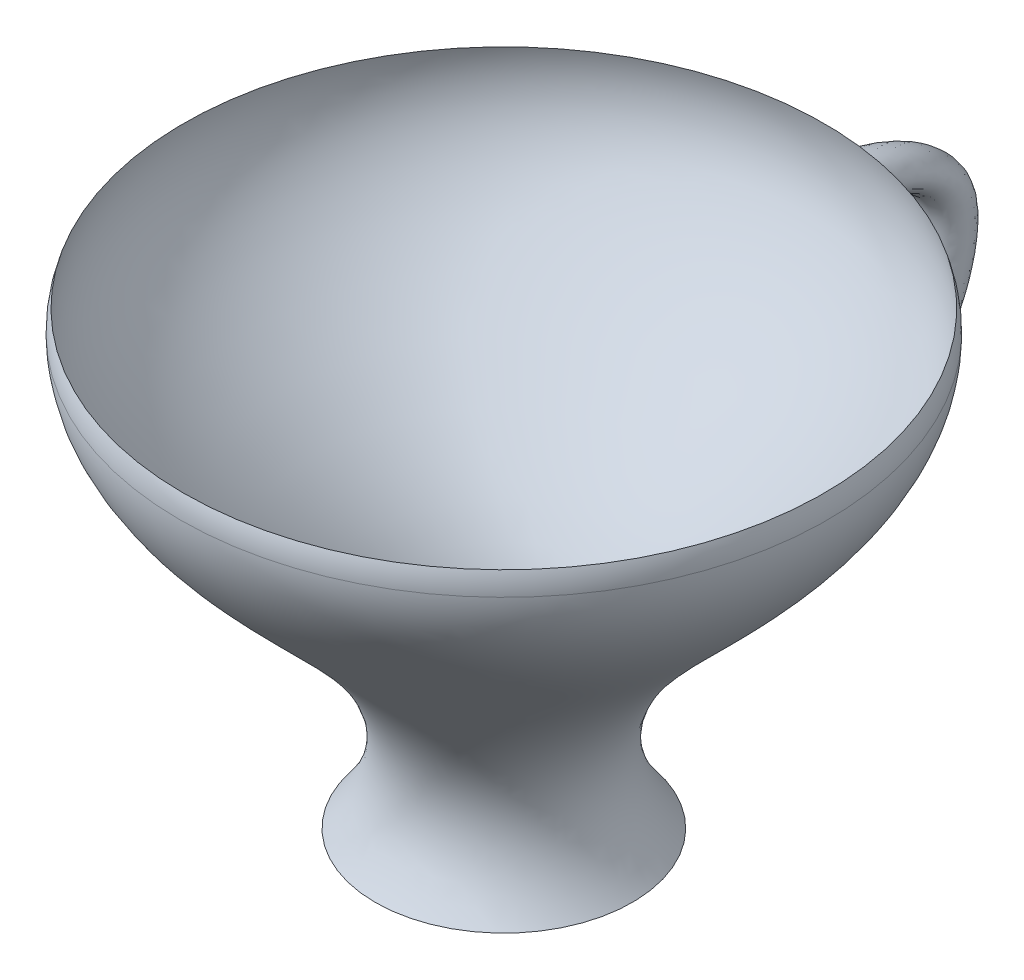
ISO-10303-21;
HEADER;
FILE_DESCRIPTION(('STEP AP214'),'2;1');
FILE_NAME('part.step','',(''),(''),'','','');
FILE_SCHEMA(('AUTOMOTIVE_DESIGN { 1 0 10303 214 1 1 1 1 }'));
ENDSEC;
DATA;
#1=APPLICATION_CONTEXT('core data for automotive mechanical design processes');
#2=APPLICATION_PROTOCOL_DEFINITION('international standard','automotive_design',2000,#1);
#3=PRODUCT_CONTEXT('',#1,'mechanical');
#4=PRODUCT('Part','Part','',(#3));
#5=PRODUCT_RELATED_PRODUCT_CATEGORY('part','',(#4));
#6=PRODUCT_DEFINITION_FORMATION('','',#4);
#7=PRODUCT_DEFINITION_CONTEXT('part definition',#1,'design');
#8=PRODUCT_DEFINITION('design','',#6,#7);
#9=PRODUCT_DEFINITION_SHAPE('','',#8);
#10=(LENGTH_UNIT() NAMED_UNIT(*) SI_UNIT(.MILLI.,.METRE.));
#11=(NAMED_UNIT(*) PLANE_ANGLE_UNIT() SI_UNIT($,.RADIAN.));
#12=(NAMED_UNIT(*) SI_UNIT($,.STERADIAN.) SOLID_ANGLE_UNIT());
#13=UNCERTAINTY_MEASURE_WITH_UNIT(LENGTH_MEASURE(1.E-05),#10,'distance_accuracy_value','');
#14=(GEOMETRIC_REPRESENTATION_CONTEXT(3) GLOBAL_UNCERTAINTY_ASSIGNED_CONTEXT((#13)) GLOBAL_UNIT_ASSIGNED_CONTEXT((#10,
#11,#12)) REPRESENTATION_CONTEXT('',''));
#15=CARTESIAN_POINT('',(0.,0.,0.));
#16=DIRECTION('',(0.,0.,1.));
#17=DIRECTION('',(1.,0.,0.));
#18=AXIS2_PLACEMENT_3D('',#15,#16,#17);
#19=CARTESIAN_POINT('',(0.,-27.2609819121447,40.077519379845));
#20=CARTESIAN_POINT('',(0.,-0.636487852068056,61.8374160642681));
#21=CARTESIAN_POINT('',(0.,18.2422413254179,4.86321013680653));
#22=CARTESIAN_POINT('',(0.,42.7390180878553,10.077519379845));
#23=CARTESIAN_POINT('',(0.,42.9839858554797,10.1296624722754));
#24=CARTESIAN_POINT('',(0.,43.228953623104,10.1818055647057));
#25=CARTESIAN_POINT('',(0.,43.4739213907284,10.2339486571361));
#26=B_SPLINE_CURVE_WITH_KNOTS('',3,(#19,#20,#21,#22,#23,#24,#25),.UNSPECIFIED.,.F.,.F.,(4,3,4),
(0.,1.,1.01),.UNSPECIFIED.);
#27=CARTESIAN_POINT('',(0.,42.7390180878553,60.077519379845));
#28=DIRECTION('',(0.,1.,0.));
#29=AXIS1_PLACEMENT('',#27,#28);
#30=SURFACE_OF_REVOLUTION('',#26,#29);
#31=CARTESIAN_POINT('',(0.,39.4140175954645,60.077519379845));
#32=DIRECTION('',(0.,1.,0.));
#33=DIRECTION('',(0.,0.,1.));
#34=AXIS2_PLACEMENT_3D('',#31,#32,#33);
#35=CIRCLE('',#34,50.338688689412);
#36=CARTESIAN_POINT('',(0.,39.4140175954645,110.416208069257));
#37=VERTEX_POINT('',#36);
#38=EDGE_CURVE('E42',#37,#37,#35,.F.);
#39=ORIENTED_EDGE('',*,*,#38,.T.);
#40=EDGE_LOOP('',(#39));
#41=FACE_BOUND('',#40,.T.);
#42=CARTESIAN_POINT('',(0.,-27.2609819121447,60.077519379845));
#43=DIRECTION('',(0.,1.,0.));
#44=DIRECTION('',(0.,0.,1.));
#45=AXIS2_PLACEMENT_3D('',#42,#43,#44);
#46=CIRCLE('',#45,20.);
#47=CARTESIAN_POINT('',(0.,-27.2609819121447,80.077519379845));
#48=VERTEX_POINT('',#47);
#49=EDGE_CURVE('E115',#48,#48,#46,.T.);
#50=ORIENTED_EDGE('',*,*,#49,.T.);
#51=EDGE_LOOP('',(#50));
#52=FACE_BOUND('',#51,.T.);
#53=CARTESIAN_POINT('',(2.03310562178877,32.2211152809582,11.4202010557278));
#54=CARTESIAN_POINT('',(2.03310130916848,32.0296062160161,11.5036331859808));
#55=CARTESIAN_POINT('',(2.01481290067568,31.8387709728222,11.5889735575393));
#56=CARTESIAN_POINT('',(1.94450578012794,31.4636517072631,11.7608411356719));
#57=CARTESIAN_POINT('',(1.89240209060572,31.2793854266813,11.8473707932215));
#58=CARTESIAN_POINT('',(1.75673686226993,30.9223077625742,12.0187760023312));
#59=CARTESIAN_POINT('',(1.67323327168575,30.7494759635576,12.1036542998223));
#60=CARTESIAN_POINT('',(1.52574466648536,30.5021788697816,12.227538076965));
#61=CARTESIAN_POINT('',(1.47289217861581,30.4217568015136,12.2682506859543));
#62=CARTESIAN_POINT('',(1.35988963247383,30.2653871388714,12.3481818672822));
#63=CARTESIAN_POINT('',(1.29973985114031,30.1894393748559,12.3874004962444));
#64=CARTESIAN_POINT('',(1.17013119349722,30.0401497408136,12.4652245470993));
#65=CARTESIAN_POINT('',(1.10042224296239,29.9669889387048,12.5037618085188));
#66=CARTESIAN_POINT('',(0.953644083949221,29.8269855833213,12.5782246441283));
#67=CARTESIAN_POINT('',(0.876574782873737,29.7601431095558,12.6141501854515));
#68=CARTESIAN_POINT('',(0.715747800401596,29.6332263643045,12.6830578406114));
#69=CARTESIAN_POINT('',(0.631986319273574,29.5731559852641,12.7160382594179));
#70=CARTESIAN_POINT('',(0.45861048633851,29.4602408255244,12.7787235851329));
#71=CARTESIAN_POINT('',(0.368996033877511,29.4073961691348,12.8084284356875));
#72=CARTESIAN_POINT('',(0.106944977514676,29.2679766320153,12.8878122879623));
#73=CARTESIAN_POINT('',(-0.0717344866228856,29.1904333669264,12.9332675244541));
#74=CARTESIAN_POINT('',(-0.441447279495883,29.0635388442283,13.0103215774558));
#75=CARTESIAN_POINT('',(-0.632474046038192,29.0141727463006,13.0419276859669));
#76=CARTESIAN_POINT('',(-1.02111028313078,28.9460789091262,13.0895123101621));
#77=CARTESIAN_POINT('',(-1.21868402099678,28.9272061956053,13.1055646262144));
#78=CARTESIAN_POINT('',(-1.51560883733806,28.9233430092687,13.1168431002445));
#79=CARTESIAN_POINT('',(-1.61470329182548,28.9261334472142,13.1184680322069));
#80=CARTESIAN_POINT('',(-1.812325305882,28.9397029567685,13.1175255732963));
#81=CARTESIAN_POINT('',(-1.91085282935899,28.9504825314353,13.1149579184133));
#82=CARTESIAN_POINT('',(-2.19077833409239,28.9924065680259,13.1017963161765));
#83=CARTESIAN_POINT('',(-2.37061586111997,29.0330913738215,13.0862005434331));
#84=CARTESIAN_POINT('',(-2.72098736141228,29.1395573145947,13.0419156236996));
#85=CARTESIAN_POINT('',(-2.89151468773003,29.2053561184845,13.0132172556045));
#86=CARTESIAN_POINT('',(-3.22568231254885,29.3635062475597,12.9423457397537));
#87=CARTESIAN_POINT('',(-3.38876905713786,29.456819802343,12.8996766786292));
#88=CARTESIAN_POINT('',(-3.61857063975539,29.6139399661438,12.8269989217293));
#89=CARTESIAN_POINT('',(-3.69269746236321,29.669169476369,12.8013283352296));
#90=CARTESIAN_POINT('',(-3.83550847671874,29.7850679707341,12.7472752449443));
#91=CARTESIAN_POINT('',(-3.90419317530627,29.8457364472038,12.7188929942477));
#92=CARTESIAN_POINT('',(-4.10098006884646,30.0350576188791,12.6301668951605));
#93=CARTESIAN_POINT('',(-4.22024617025701,30.1713206988212,12.5661067303183));
#94=CARTESIAN_POINT('',(-4.43361333658643,30.4593098394754,12.4311535434832));
#95=CARTESIAN_POINT('',(-4.52767891953543,30.6110572914327,12.3602510765715));
#96=CARTESIAN_POINT('',(-4.69411550991868,30.9348332129381,12.2100879456882));
#97=CARTESIAN_POINT('',(-4.7650012987494,31.1075189301131,12.1305819344976));
#98=CARTESIAN_POINT('',(-4.84834480119735,31.3727494241605,12.0097701713009));
#99=CARTESIAN_POINT('',(-4.87229600904299,31.4621999580435,11.9692377948748));
#100=CARTESIAN_POINT('',(-4.9123477229145,31.6427487350274,11.8878960367614));
#101=CARTESIAN_POINT('',(-4.92844814278487,31.7338469961993,11.847086652039));
#102=CARTESIAN_POINT('',(-4.95333777388172,31.923134173048,11.7628104736071));
#103=CARTESIAN_POINT('',(-4.96157832087993,32.0213963292384,11.7193449035525));
#104=CARTESIAN_POINT('',(-4.96846799962926,32.2184188850978,11.6327735920325));
#105=CARTESIAN_POINT('',(-4.96711713770966,32.3171792844378,11.5896678503298));
#106=CARTESIAN_POINT('',(-4.95484114127717,32.514474630819,11.5041660613368));
#107=CARTESIAN_POINT('',(-4.94391110823635,32.6130094366465,11.4617703884623));
#108=CARTESIAN_POINT('',(-4.91273032244971,32.8090348825069,11.3780672721256));
#109=CARTESIAN_POINT('',(-4.89247908180862,32.9065254676094,11.3367598857467));
#110=CARTESIAN_POINT('',(-4.82018840148013,33.1878958028458,11.218481411671));
#111=CARTESIAN_POINT('',(-4.7559975308886,33.3695543082955,11.1433078934948));
#112=CARTESIAN_POINT('',(-4.59553072083588,33.7210497092935,10.9999316539327));
#113=CARTESIAN_POINT('',(-4.49926860729125,33.8908916608855,10.9317259452505));
#114=CARTESIAN_POINT('',(-4.33235876203711,34.1320587986824,10.8359396578722));
#115=CARTESIAN_POINT('',(-4.27304015896225,34.2101103369334,10.8051256085947));
#116=CARTESIAN_POINT('',(-4.14712937063008,34.3610697519072,10.7457745848873));
#117=CARTESIAN_POINT('',(-4.08053805097642,34.433978239063,10.7172373401686));
#118=CARTESIAN_POINT('',(-3.94043605496242,34.5737605923944,10.6626326290112));
#119=CARTESIAN_POINT('',(-3.86692857601639,34.6406372194268,10.636564032366));
#120=CARTESIAN_POINT('',(-3.71368424852763,34.7678426196997,10.5869750184552));
#121=CARTESIAN_POINT('',(-3.63394707531886,34.8281710512833,10.5634547341497));
#122=CARTESIAN_POINT('',(-3.39791929639397,34.9910158340399,10.4998167285778));
#123=CARTESIAN_POINT('',(-3.23485013033157,35.0851097908071,10.4628537842471));
#124=CARTESIAN_POINT('',(-2.89459885489015,35.2476203514675,10.3979358433011));
#125=CARTESIAN_POINT('',(-2.71740486753453,35.3160150620159,10.3699885300108));
#126=CARTESIAN_POINT('',(-2.44028633260879,35.3993778024507,10.3343524722458));
#127=CARTESIAN_POINT('',(-2.3436651558618,35.4242885259908,10.3233483841914));
#128=CARTESIAN_POINT('',(-2.1484670655173,35.466337940766,10.3038780931077));
#129=CARTESIAN_POINT('',(-2.04989008923794,35.4834763824842,10.2954119715588));
#130=CARTESIAN_POINT('',(-1.85157958650691,35.5097102870275,10.2810731436221));
#131=CARTESIAN_POINT('',(-1.75184722515172,35.5188132403777,10.2751980245149));
#132=CARTESIAN_POINT('',(-1.5518541095629,35.5287080280987,10.266103940172));
#133=CARTESIAN_POINT('',(-1.45159340833303,35.5295006808665,10.2628847134133));
#134=CARTESIAN_POINT('',(-1.25248479660537,35.5227383303279,10.2591640502226));
#135=CARTESIAN_POINT('',(-1.15363415412217,35.5152815319881,10.2586310514268));
#136=CARTESIAN_POINT('',(-0.956889021650823,35.4924602624546,10.2601654567153));
#137=CARTESIAN_POINT('',(-0.858994628622198,35.4770949976861,10.2622331217931));
#138=CARTESIAN_POINT('',(-0.567546253235149,35.419418264591,10.2723396836714));
#139=CARTESIAN_POINT('',(-0.37628882379912,35.365528195683,10.2842832778419));
#140=CARTESIAN_POINT('',(-0.00475180731605677,35.2283878635488,10.3187921841985));
#141=CARTESIAN_POINT('',(0.175483181257731,35.1450265282136,10.341397788861));
#142=CARTESIAN_POINT('',(0.432609020799168,34.9995504565397,10.3834363431512));
#143=CARTESIAN_POINT('',(0.51609815330213,34.9476649020211,10.3988004188536));
#144=CARTESIAN_POINT('',(0.678042199123248,34.83730625332,10.432280669862));
#145=CARTESIAN_POINT('',(0.756497679835792,34.7788339036574,10.4503965342077));
#146=CARTESIAN_POINT('',(0.906075231974763,34.6568460087515,10.4890066036166));
#147=CARTESIAN_POINT('',(0.977312287179697,34.5934541855827,10.5094462186591));
#148=CARTESIAN_POINT('',(1.11350804507061,34.4610736389394,10.5529547669029));
#149=CARTESIAN_POINT('',(1.17846660894821,34.3920847917847,10.5760237582113));
#150=CARTESIAN_POINT('',(1.30181885367053,34.2492052119161,10.6246749992017));
#151=CARTESIAN_POINT('',(1.36020785788499,34.1753110460406,10.6502590152655));
#152=CARTESIAN_POINT('',(1.470079786392,34.0233871825218,10.703775576105));
#153=CARTESIAN_POINT('',(1.52156263856159,33.9453574417013,10.7317081454024));
#154=CARTESIAN_POINT('',(1.66143588921943,33.7125490415516,10.8164484939399));
#155=CARTESIAN_POINT('',(1.74035035078382,33.5530392006374,10.8762354575788));
#156=CARTESIAN_POINT('',(1.87073069590779,33.2259834103166,11.0025783720213));
#157=CARTESIAN_POINT('',(1.92222363025705,33.0584455589296,11.0691275745281));
#158=CARTESIAN_POINT('',(1.98397059948181,32.7785833398495,11.1833707418641));
#159=CARTESIAN_POINT('',(2.0023430742452,32.6673720243178,11.2295500306727));
#160=CARTESIAN_POINT('',(2.02690947846632,32.444402569838,11.323671295075));
#161=CARTESIAN_POINT('',(2.03310813333496,32.3326446599506,11.3716125793653));
#162=CARTESIAN_POINT('',(2.03310562178877,32.2211152809582,11.4202010557278));
#163=B_SPLINE_CURVE_WITH_KNOTS('',3,(#53,#54,#55,#56,#57,#58,#59,#60,#61,#62,#63,#64,#65,#66,
#67,#68,#69,#70,#71,#72,#73,#74,#75,#76,#77,#78,#79,#80,#81,#82,#83,#84,#85,#86,#87,#88,#89,#90,
#91,#92,#93,#94,#95,#96,#97,#98,#99,#100,#101,#102,#103,#104,#105,#106,#107,#108,#109,#110,#111,
#112,#113,#114,#115,#116,#117,#118,#119,#120,#121,#122,#123,#124,#125,#126,#127,#128,#129,#130,
#131,#132,#133,#134,#135,#136,#137,#138,#139,#140,#141,#142,#143,#144,#145,#146,#147,#148,#149,
#150,#151,#152,#153,#154,#155,#156,#157,#158,#159,#160,#161,#162),.UNSPECIFIED.,.T.,.F.,(4,2,2,
2,2,2,2,2,2,2,2,2,2,2,2,2,2,2,2,2,2,2,2,2,2,2,2,2,2,2,2,2,2,2,2,2,2,2,2,2,2,2,2,2,2,2,2,2,2,2,2,
2,2,2,4),(0.,0.626253276820317,1.25408644780266,1.88076660004478,2.19395083210101,
2.5071231822471,2.831130593002,3.15514208048009,3.47933886294511,3.8035412221135,
4.4005312208698,4.99720650679617,5.59103659060584,5.88810401113808,6.18519013892674,
6.73762648293025,7.29045221119276,7.86553148433693,8.15305144703158,8.44054460065652,
9.01393311861799,9.58812476631344,10.1940307004499,10.4970276452372,10.800027915075,
11.1228973831645,11.4457666381959,11.7688010961958,12.0918524645488,12.7092471392869,
13.3263759987647,13.634322888701,13.9422331664509,14.2500017869693,14.5577864578362,
15.1306907190421,15.7040819402676,16.0049426667032,16.3058130511174,16.6064026729656,
16.9069626925234,17.2039828521711,17.5010328221089,18.0953158410422,18.6918629149189,
18.990019818577,19.2881430546595,19.5803252734963,19.8725139505834,20.1649093274615,
20.457307757672,21.0179818692416,21.5781018575743,21.9429554292576,22.3076673507372),.UNSPECIFIED.);
#164=CARTESIAN_POINT('',(2.03310562178877,32.2211152809582,11.4202010557278));
#165=VERTEX_POINT('',#164);
#166=EDGE_CURVE('E47',#165,#165,#163,.T.);
#167=ORIENTED_EDGE('',*,*,#166,.F.);
#168=EDGE_LOOP('',(#167));
#169=FACE_BOUND('',#168,.T.);
#170=CARTESIAN_POINT('',(2.03310562178876,-2.34492301421573,40.666565405461));
#171=CARTESIAN_POINT('',(2.03309877917106,-2.50356607698455,40.7739012216794));
#172=CARTESIAN_POINT('',(2.01646360289619,-2.66382042432878,40.8789650044562));
#173=CARTESIAN_POINT('',(1.95154890213081,-2.98288122254748,41.0815450892652));
#174=CARTESIAN_POINT('',(1.90322030899889,-3.14168504048563,41.1790494253666));
#175=CARTESIAN_POINT('',(1.77689759165251,-3.45283732975706,41.3642185545899));
#176=CARTESIAN_POINT('',(1.69895076640582,-3.60519566533438,41.4518987488308));
#177=CARTESIAN_POINT('',(1.56148840140044,-3.82521556985352,41.5750396549686));
#178=CARTESIAN_POINT('',(1.51224551393742,-3.89713413199249,41.6146891128476));
#179=CARTESIAN_POINT('',(1.4071313322862,-4.03759426364678,41.691143205848));
#180=CARTESIAN_POINT('',(1.35126007820138,-4.10613585359013,41.727947858179));
#181=CARTESIAN_POINT('',(1.2321456243246,-4.24035604539312,41.799241514913));
#182=CARTESIAN_POINT('',(1.16878898127775,-4.30596204333937,41.8336776901897));
#183=CARTESIAN_POINT('',(1.03584043659924,-4.4322402379085,41.8994138290925));
#184=CARTESIAN_POINT('',(0.966248805031464,-4.49291264800911,41.9307139284312));
#185=CARTESIAN_POINT('',(0.821364137966679,-4.60877631273391,41.9902398249981));
#186=CARTESIAN_POINT('',(0.746068653309534,-4.66396518901849,42.0184642887588));
#187=CARTESIAN_POINT('',(0.590543271736752,-4.76846229352657,42.0719869645314));
#188=CARTESIAN_POINT('',(0.510312937967921,-4.81776999998578,42.0972849169038));
#189=CARTESIAN_POINT('',(0.266317208837004,-4.954581514744,42.1681091788845));
#190=CARTESIAN_POINT('',(0.0963472210194035,-5.03327252511417,42.2097205079678));
#191=CARTESIAN_POINT('',(-0.255458982334168,-5.1643127096742,42.2832082343349));
#192=CARTESIAN_POINT('',(-0.437297064176938,-5.21665772951882,42.3150830960207));
#193=CARTESIAN_POINT('',(-0.720494710815941,-5.27490243963006,42.3565625922319));
#194=CARTESIAN_POINT('',(-0.819348007086711,-5.29106329250245,42.3695791496045));
#195=CARTESIAN_POINT('',(-1.01838320153293,-5.31519688170303,42.3929400308411));
#196=CARTESIAN_POINT('',(-1.1185650416575,-5.32316997461004,42.4032844710617));
#197=CARTESIAN_POINT('',(-1.31943547701659,-5.33066028056451,42.4211834328526));
#198=CARTESIAN_POINT('',(-1.42012374622515,-5.33018237372953,42.4287395619886));
#199=CARTESIAN_POINT('',(-1.62126948520436,-5.32066607295951,42.440939588385));
#200=CARTESIAN_POINT('',(-1.72172695610072,-5.31162772086709,42.4455834998799));
#201=CARTESIAN_POINT('',(-1.91788234717428,-5.28583242778351,42.4518715060735));
#202=CARTESIAN_POINT('',(-2.01361702123962,-5.26937903084355,42.4536220011305));
#203=CARTESIAN_POINT('',(-2.2035290649203,-5.22917968953192,42.4544174765922));
#204=CARTESIAN_POINT('',(-2.29770641640967,-5.20543366034284,42.4534624255288));
#205=CARTESIAN_POINT('',(-2.57726048173964,-5.12366333942609,42.4464187088606));
#206=CARTESIAN_POINT('',(-2.75958515347918,-5.05511689240698,42.4361490251448));
#207=CARTESIAN_POINT('',(-3.11889420251301,-4.88916886542623,42.4025506406579));
#208=CARTESIAN_POINT('',(-3.29530609169145,-4.7906470103685,42.3786760761909));
#209=CARTESIAN_POINT('',(-3.62880536538986,-4.56897573880734,42.3153514443355));
#210=CARTESIAN_POINT('',(-3.78591884149434,-4.44586017842554,42.27592271713));
#211=CARTESIAN_POINT('',(-4.00070338083515,-4.24716336504725,42.2040142417147));
#212=CARTESIAN_POINT('',(-4.06813801118901,-4.17947326861069,42.1782933429006));
#213=CARTESIAN_POINT('',(-4.19654009481407,-4.03983953345807,42.1226022294568));
#214=CARTESIAN_POINT('',(-4.25750709127817,-3.96789559485254,42.092631715027));
#215=CARTESIAN_POINT('',(-4.43019785905297,-3.74669819402159,41.9963603627));
#216=CARTESIAN_POINT('',(-4.53173163957831,-3.59206022429905,41.9236930056388));
#217=CARTESIAN_POINT('',(-4.70022922103195,-3.28256874308558,41.7665742063417));
#218=CARTESIAN_POINT('',(-4.76869030941356,-3.12812732131486,41.6829114194855));
#219=CARTESIAN_POINT('',(-4.84947541152401,-2.8945769278729,41.5480544082135));
#220=CARTESIAN_POINT('',(-4.87275294160734,-2.81641047449146,41.5015405560356));
#221=CARTESIAN_POINT('',(-4.91180213020845,-2.65997001211012,41.4056572424009));
#222=CARTESIAN_POINT('',(-4.92757672534399,-2.58169605723589,41.3562889066765));
#223=CARTESIAN_POINT('',(-4.95136253139762,-2.42604380322147,41.2553191177665));
#224=CARTESIAN_POINT('',(-4.95941669007613,-2.34866294316316,41.2037317062958));
#225=CARTESIAN_POINT('',(-4.96771681897201,-2.19491899602521,41.0984615551612));
#226=CARTESIAN_POINT('',(-4.96796327920923,-2.11855584537366,41.0447789472059));
#227=CARTESIAN_POINT('',(-4.96071778201964,-1.96733852323777,40.9357792489546));
#228=CARTESIAN_POINT('',(-4.95322287465738,-1.89248493807587,40.8804615433918));
#229=CARTESIAN_POINT('',(-4.93085280646587,-1.74473821058779,40.7687403507552));
#230=CARTESIAN_POINT('',(-4.91597690167613,-1.67184526666348,40.7123367547812));
#231=CARTESIAN_POINT('',(-4.86109417673023,-1.45803273748217,40.5433326107105));
#232=CARTESIAN_POINT('',(-4.81074288346035,-1.32039763429562,40.4297885462957));
#233=CARTESIAN_POINT('',(-4.68451864530146,-1.05628605664704,40.20386646731));
#234=CARTESIAN_POINT('',(-4.60863163894927,-0.929815778735516,40.0914891304306));
#235=CARTESIAN_POINT('',(-4.47222995233977,-0.743321430832713,39.9203323699375));
#236=CARTESIAN_POINT('',(-4.41985222054308,-0.678729029290692,39.8599110456692));
#237=CARTESIAN_POINT('',(-4.30803839830458,-0.553912798977287,39.7410785440418));
#238=CARTESIAN_POINT('',(-4.24860209046504,-0.493689104850203,39.6826674286669));
#239=CARTESIAN_POINT('',(-4.12298652651164,-0.378019467985911,39.5685143066683));
#240=CARTESIAN_POINT('',(-4.05681075508273,-0.322571083242133,39.5127709423635));
#241=CARTESIAN_POINT('',(-3.91794946985193,-0.216850988439467,39.4045862228164));
#242=CARTESIAN_POINT('',(-3.84526431665828,-0.166578991949101,39.3521446849324));
#243=CARTESIAN_POINT('',(-3.69431459129185,-0.0716062436640808,39.2513120312441));
#244=CARTESIAN_POINT('',(-3.61607683083665,-0.0268812485429825,39.2029036171678));
#245=CARTESIAN_POINT('',(-3.45438796709666,0.0571502360697407,39.1103151731311));
#246=CARTESIAN_POINT('',(-3.37093642592029,0.0964562695457614,39.0661354991224));
#247=CARTESIAN_POINT('',(-3.11348494809026,0.206116913316634,38.9404960645122));
#248=CARTESIAN_POINT('',(-2.93241524894856,0.268197192294077,38.865954013566));
#249=CARTESIAN_POINT('',(-2.55657356700105,0.368726988869929,38.7387381539256));
#250=CARTESIAN_POINT('',(-2.36180847759505,0.407188301220022,38.6860534344698));
#251=CARTESIAN_POINT('',(-2.06373699048942,0.445769817821137,38.625683068909));
#252=CARTESIAN_POINT('',(-1.96342147509574,0.455445211341402,38.6086712232041));
#253=CARTESIAN_POINT('',(-1.76147002544118,0.468202934180939,38.5811520956466));
#254=CARTESIAN_POINT('',(-1.6598343333855,0.471286456153523,38.5706436373945));
#255=CARTESIAN_POINT('',(-1.4616157915645,0.470583583313126,38.5568404395243));
#256=CARTESIAN_POINT('',(-1.36505663110656,0.467159363387507,38.5531866242198));
#257=CARTESIAN_POINT('',(-1.17233276527235,0.454213095135629,38.5519654223481));
#258=CARTESIAN_POINT('',(-1.07616808181363,0.444690712486485,38.5543983694999));
#259=CARTESIAN_POINT('',(-0.789205721529734,0.407245139054665,38.5705980671675));
#260=CARTESIAN_POINT('',(-0.599927795172481,0.370443444221391,38.5932648833108));
#261=CARTESIAN_POINT('',(-0.238015275349301,0.27647250329254,38.6592682807177));
#262=CARTESIAN_POINT('',(-0.0650256850690537,0.220093116846099,38.7018227210687));
#263=CARTESIAN_POINT('',(0.267521349849024,0.0880501546044529,38.8051915284191));
#264=CARTESIAN_POINT('',(0.427085972260882,0.012396971994063,38.8659960573945));
#265=CARTESIAN_POINT('',(0.736532039101237,-0.16163480517224,39.0072237267854));
#266=CARTESIAN_POINT('',(0.885479270392337,-0.260990116696533,39.0885022273982));
#267=CARTESIAN_POINT('',(1.15895619299821,-0.478600662875319,39.2656144525476));
#268=CARTESIAN_POINT('',(1.28347750807543,-0.596862355840217,39.3614531502053));
#269=CARTESIAN_POINT('',(1.50471471753915,-0.847453257425909,39.5618310282436));
#270=CARTESIAN_POINT('',(1.60172086496414,-0.979613772399568,39.66626313941));
#271=CARTESIAN_POINT('',(1.76797538706309,-1.25629882733022,39.8807515772803));
#272=CARTESIAN_POINT('',(1.83722440982037,-1.40082307851864,39.9908077726036));
#273=CARTESIAN_POINT('',(1.93775153044561,-1.67710188129693,40.1961647571118));
#274=CARTESIAN_POINT('',(1.9731499207037,-1.8075504965357,40.2912207211806));
#275=CARTESIAN_POINT('',(2.02081886263739,-2.073246310219,40.4802657779291));
#276=CARTESIAN_POINT('',(2.03311150649094,-2.20848879886236,40.5742558042123));
#277=CARTESIAN_POINT('',(2.03310562178876,-2.34492301421573,40.666565405461));
#278=B_SPLINE_CURVE_WITH_KNOTS('',3,(#170,#171,#172,#173,#174,#175,#176,#177,#178,#179,#180,
#181,#182,#183,#184,#185,#186,#187,#188,#189,#190,#191,#192,#193,#194,#195,#196,#197,#198,#199,
#200,#201,#202,#203,#204,#205,#206,#207,#208,#209,#210,#211,#212,#213,#214,#215,#216,#217,#218,
#219,#220,#221,#222,#223,#224,#225,#226,#227,#228,#229,#230,#231,#232,#233,#234,#235,#236,#237,
#238,#239,#240,#241,#242,#243,#244,#245,#246,#247,#248,#249,#250,#251,#252,#253,#254,#255,#256,
#257,#258,#259,#260,#261,#262,#263,#264,#265,#266,#267,#268,#269,#270,#271,#272,#273,#274,#275,
#276,#277),.UNSPECIFIED.,.T.,.F.,(4,2,2,2,2,2,2,2,2,2,2,2,2,2,2,2,2,2,2,2,2,2,2,2,2,2,2,2,2,2,2,
2,2,2,2,2,2,2,2,2,2,2,2,2,2,2,2,2,2,2,2,2,2,4),(0.,0.574051420097493,1.14899370771343,
1.72302167139521,2.01002033047474,2.29701725322463,2.58911871610975,2.88120753294888,
3.17342248768623,3.46566334783051,4.03865750582947,4.61174198764331,4.91444683766264,
5.21713850425704,5.51965538411571,5.82217078530854,6.11329190350487,6.40441640773158,
6.9868871510572,7.5945627379691,8.20140748252932,8.49789793867181,8.79440932192606,
9.38734778992811,9.9500878209457,10.231469304573,10.5127405658376,10.7924379129357,
11.0721177058818,11.3519041133014,11.6317187272522,12.1855429209405,12.7396725831798,
13.0477452359343,13.3558273795094,13.6637510281941,13.9716576289928,14.2781671728728,
14.584702494372,15.1978818586543,15.8107547661722,16.1170195281234,16.4232288735508,
16.7128939703764,17.0025749490285,17.5819014997141,18.1401476022256,18.698093311419,
19.2850357423912,19.872179099594,20.4528765159659,21.0335603732157,21.5277215942174,
22.0214100903076),.UNSPECIFIED.);
#279=CARTESIAN_POINT('',(2.03310562178876,-2.34492301421573,40.666565405461));
#280=VERTEX_POINT('',#279);
#281=EDGE_CURVE('E10',#280,#280,#278,.T.);
#282=ORIENTED_EDGE('',*,*,#281,.F.);
#283=EDGE_LOOP('',(#282));
#284=FACE_BOUND('',#283,.T.);
#285=ADVANCED_FACE('F38',(#41,#52,#169,#284),#30,.T.);
#286=CARTESIAN_POINT('',(0.,-27.2609819121447,60.077519379845));
#287=DIRECTION('',(0.,1.,0.));
#288=DIRECTION('',(0.,0.,1.));
#289=AXIS2_PLACEMENT_3D('',#286,#287,#288);
#290=PLANE('',#289);
#291=ORIENTED_EDGE('',*,*,#49,.F.);
#292=EDGE_LOOP('',(#291));
#293=FACE_BOUND('',#292,.T.);
#294=ADVANCED_FACE('F100',(#293),#290,.F.);
#295=CARTESIAN_POINT('',(0.,-27.2609819121447,40.077519379845));
#296=CARTESIAN_POINT('',(0.,-0.636487852068056,61.8374160642681));
#297=CARTESIAN_POINT('',(0.,18.2422413254179,4.86321013680653));
#298=CARTESIAN_POINT('',(0.,42.9839858554797,10.1296624722754));
#299=CARTESIAN_POINT('',(0.,43.228953623104,10.1818055647057));
#300=CARTESIAN_POINT('',(0.,43.4739213907284,10.2339486571361));
#301=B_SPLINE_CURVE_WITH_KNOTS('',3,(#295,#296,#297,#298,#299,#300),.UNSPECIFIED.,.F.,.F.,(4,2,
4),(0.,1.,1.01),.UNSPECIFIED.);
#302=CARTESIAN_POINT('',(0.,42.7390180878553,60.077519379845));
#303=DIRECTION('',(0.,1.,0.));
#304=AXIS1_PLACEMENT('',#302,#303);
#305=SURFACE_OF_REVOLUTION('',#301,#304);
#306=OFFSET_SURFACE('',#305,-0.2,.F.);
#307=CARTESIAN_POINT('',(0.,42.7390180878553,60.077519379845));
#308=DIRECTION('',(0.,1.,0.));
#309=DIRECTION('',(0.,0.,1.));
#310=AXIS2_PLACEMENT_3D('',#307,#308,#309);
#311=CIRCLE('',#310,49.7955193816377);
#312=CARTESIAN_POINT('',(0.,42.7390180878553,109.873038761483));
#313=VERTEX_POINT('',#312);
#314=EDGE_CURVE('E114',#313,#313,#311,.T.);
#315=ORIENTED_EDGE('',*,*,#314,.T.);
#316=EDGE_LOOP('',(#315));
#317=FACE_BOUND('',#316,.T.);
#318=CARTESIAN_POINT('',(0.,-27.0609819121447,60.077519379845));
#319=DIRECTION('',(0.,1.,0.));
#320=DIRECTION('',(0.,0.,1.));
#321=AXIS2_PLACEMENT_3D('',#318,#319,#320);
#322=CIRCLE('',#321,19.5818507388101);
#323=CARTESIAN_POINT('',(0.,-27.0609819121447,79.659370118655));
#324=VERTEX_POINT('',#323);
#325=EDGE_CURVE('E64',#324,#324,#322,.T.);
#326=ORIENTED_EDGE('',*,*,#325,.F.);
#327=EDGE_LOOP('',(#326));
#328=FACE_BOUND('',#327,.T.);
#329=ADVANCED_FACE('F73',(#317,#328),#306,.F.);
#330=CARTESIAN_POINT('',(0.,-27.0609819121447,60.077519379845));
#331=DIRECTION('',(0.,1.,0.));
#332=DIRECTION('',(0.,0.,1.));
#333=AXIS2_PLACEMENT_3D('',#330,#331,#332);
#334=PLANE('',#333);
#335=ORIENTED_EDGE('',*,*,#325,.T.);
#336=EDGE_LOOP('',(#335));
#337=FACE_BOUND('',#336,.T.);
#338=ADVANCED_FACE('F110',(#337),#334,.T.);
#339=CARTESIAN_POINT('',(0.,39.4873359311726,60.077519379845));
#340=DIRECTION('',(0.,1.,0.));
#341=DIRECTION('',(0.,0.,1.));
#342=AXIS2_PLACEMENT_3D('',#339,#340,#341);
#343=TOROIDAL_SURFACE('',#342,40.3389574719417,10.);
#344=ORIENTED_EDGE('',*,*,#38,.F.);
#345=EDGE_LOOP('',(#344));
#346=FACE_BOUND('',#345,.T.);
#347=ORIENTED_EDGE('',*,*,#314,.F.);
#348=EDGE_LOOP('',(#347));
#349=FACE_BOUND('',#348,.T.);
#350=ADVANCED_FACE('F40',(#346,#349),#343,.T.);
#351=CARTESIAN_POINT('',(2.03310562178876,2.33387188233328,48.9857668336039));
#352=CARTESIAN_POINT('',(2.03310562178876,-0.331529432636647,44.8377353252633));
#353=CARTESIAN_POINT('',(2.03310562178876,-2.73422873667055,40.2732224693414));
#354=CARTESIAN_POINT('',(2.03310562178876,-6.43416341056407,30.8791475572343));
#355=CARTESIAN_POINT('',(2.03310562178876,-7.73044592117756,26.0504360998673));
#356=CARTESIAN_POINT('',(2.03310562178876,-8.65386106189063,16.6933271714251));
#357=CARTESIAN_POINT('',(2.03310562178876,-8.28334588506591,12.1695501407851));
#358=CARTESIAN_POINT('',(2.03310562178876,-5.70543026694551,4.98143143939586));
#359=CARTESIAN_POINT('',(2.03310562178876,-3.9888880257436,2.12736338440507));
#360=CARTESIAN_POINT('',(2.03310562178876,-1.51481642360852,-0.406150387479465));
#361=CARTESIAN_POINT('',(2.03310562178876,1.49179987120543,49.347037495798));
#362=CARTESIAN_POINT('',(2.03310562178876,-1.19533302459333,45.1483146169933));
#363=CARTESIAN_POINT('',(2.03310562178876,-3.61641219121885,40.5301617409995));
#364=CARTESIAN_POINT('',(2.03310562178876,-7.34468808203847,31.0024774376785));
#365=CARTESIAN_POINT('',(2.03310562178876,-8.65190297436616,26.0933610146266));
#366=CARTESIAN_POINT('',(2.03310562178876,-9.56063056122183,16.5239320000439));
#367=CARTESIAN_POINT('',(2.03310562178876,-9.162504631923,11.8630048933523));
#368=CARTESIAN_POINT('',(2.03310562178876,-6.44287576953866,4.42381888756144));
#369=CARTESIAN_POINT('',(2.03310562178876,-4.63189473044468,1.46530750898542));
#370=CARTESIAN_POINT('',(2.03310562178876,-2.05243369540467,-1.1466593060702));
#371=CARTESIAN_POINT('',(1.65589978442311,0.654913198656272,49.7060835136895));
#372=CARTESIAN_POINT('',(1.65589978442311,-2.05381866059421,45.4569804382287));
#373=CARTESIAN_POINT('',(1.65589978442311,-4.49316330762905,40.7855188236063));
#374=CARTESIAN_POINT('',(1.65589978442311,-8.2496058949037,31.1250478733487));
#375=CARTESIAN_POINT('',(1.65589978442311,-9.56768584916112,26.1360216049237));
#376=CARTESIAN_POINT('',(1.65589978442311,-10.4618163256707,16.3555799358085));
#377=CARTESIAN_POINT('',(1.65589978442311,-10.0362496662888,11.5583473002789));
#378=CARTESIAN_POINT('',(1.65589978442311,-7.17578020608878,3.86964002053666));
#379=CARTESIAN_POINT('',(1.65589978442311,-5.27094190742597,0.807328462893316));
#380=CARTESIAN_POINT('',(1.65589978442311,-2.5867404099785,-1.88260829461633));
#381=CARTESIAN_POINT('',(0.360058927460252,-0.535956459975527,50.216997383852));
#382=CARTESIAN_POINT('',(0.360058927460252,-3.27542442879942,45.8962034230348));
#383=CARTESIAN_POINT('',(0.360058927460252,-5.74075911355397,41.1488858263015));
#384=CARTESIAN_POINT('',(0.360058927460252,-9.53728223417653,31.2994626629088));
#385=CARTESIAN_POINT('',(0.360058927460252,-10.8708229109164,26.196726601543));
#386=CARTESIAN_POINT('',(0.360058927460252,-11.7441820495795,16.1160189870377));
#387=CARTESIAN_POINT('',(0.360058927460252,-11.2795678895635,11.1248268538831));
#388=CARTESIAN_POINT('',(0.360058927460252,-8.2186856373742,3.08105678717944));
#389=CARTESIAN_POINT('',(0.360058927460252,-6.18029070991337,-0.128959935176396));
#390=CARTESIAN_POINT('',(0.360058927460252,-3.347046047119,-2.92984605034677));
#391=CARTESIAN_POINT('',(-0.550596520914213,-0.882606269914682,50.3657191139787));
#392=CARTESIAN_POINT('',(-0.550596520914213,-3.63102147934999,46.0240564484333));
#393=CARTESIAN_POINT('',(-0.550596520914213,-6.10392131680086,41.2546581931615));
#394=CARTESIAN_POINT('',(-0.550596520914213,-9.91211146509428,31.350232999713));
#395=CARTESIAN_POINT('',(-0.550596520914213,-11.250152597855,26.2143971966249));
#396=CARTESIAN_POINT('',(-0.550596520914213,-12.1174654154223,16.0462852787759));
#397=CARTESIAN_POINT('',(-0.550596520914213,-11.6414849328636,10.9986335469529));
#398=CARTESIAN_POINT('',(-0.550596520914213,-8.52226459490944,2.85150838447666));
#399=CARTESIAN_POINT('',(-0.550596520914213,-6.4449927176088,-0.401503779829841));
#400=CARTESIAN_POINT('',(-0.550596520914213,-3.56836313475897,-3.23468610262089));
#401=CARTESIAN_POINT('',(-2.38319223550826,-0.882606269914682,50.3657191139787));
#402=CARTESIAN_POINT('',(-2.38319223550826,-3.63102147934999,46.0240564484333));
#403=CARTESIAN_POINT('',(-2.38319223550826,-6.10392131680086,41.2546581931615));
#404=CARTESIAN_POINT('',(-2.38319223550826,-9.91211146509428,31.350232999713));
#405=CARTESIAN_POINT('',(-2.38319223550826,-11.250152597855,26.2143971966249));
#406=CARTESIAN_POINT('',(-2.38319223550826,-12.1174654154223,16.0462852787759));
#407=CARTESIAN_POINT('',(-2.38319223550826,-11.6414849328636,10.9986335469529));
#408=CARTESIAN_POINT('',(-2.38319223550826,-8.52226459490944,2.85150838447666));
#409=CARTESIAN_POINT('',(-2.38319223550826,-6.4449927176088,-0.401503779829841));
#410=CARTESIAN_POINT('',(-2.38319223550826,-3.56836313475897,-3.23468610262089));
#411=CARTESIAN_POINT('',(-3.29384768388272,-0.535956459975527,50.216997383852));
#412=CARTESIAN_POINT('',(-3.29384768388272,-3.27542442879942,45.8962034230348));
#413=CARTESIAN_POINT('',(-3.29384768388272,-5.74075911355397,41.1488858263015));
#414=CARTESIAN_POINT('',(-3.29384768388272,-9.53728223417653,31.2994626629088));
#415=CARTESIAN_POINT('',(-3.29384768388272,-10.8708229109164,26.196726601543));
#416=CARTESIAN_POINT('',(-3.29384768388272,-11.7441820495795,16.1160189870377));
#417=CARTESIAN_POINT('',(-3.29384768388272,-11.2795678895635,11.1248268538831));
#418=CARTESIAN_POINT('',(-3.29384768388272,-8.2186856373742,3.08105678717944));
#419=CARTESIAN_POINT('',(-3.29384768388272,-6.18029070991337,-0.128959935176396));
#420=CARTESIAN_POINT('',(-3.29384768388272,-3.347046047119,-2.92984605034677));
#421=CARTESIAN_POINT('',(-4.58968854084558,0.654913198656272,49.7060835136895));
#422=CARTESIAN_POINT('',(-4.58968854084558,-2.05381866059421,45.4569804382287));
#423=CARTESIAN_POINT('',(-4.58968854084558,-4.49316330762905,40.7855188236063));
#424=CARTESIAN_POINT('',(-4.58968854084558,-8.2496058949037,31.1250478733487));
#425=CARTESIAN_POINT('',(-4.58968854084558,-9.56768584916112,26.1360216049237));
#426=CARTESIAN_POINT('',(-4.58968854084558,-10.4618163256707,16.3555799358085));
#427=CARTESIAN_POINT('',(-4.58968854084558,-10.0362496662888,11.5583473002789));
#428=CARTESIAN_POINT('',(-4.58968854084558,-7.17578020608878,3.86964002053666));
#429=CARTESIAN_POINT('',(-4.58968854084558,-5.27094190742597,0.807328462893316));
#430=CARTESIAN_POINT('',(-4.58968854084558,-2.5867404099785,-1.88260829461633));
#431=CARTESIAN_POINT('',(-4.96689437821124,1.49179987120543,49.347037495798));
#432=CARTESIAN_POINT('',(-4.96689437821124,-1.19533302459333,45.1483146169933));
#433=CARTESIAN_POINT('',(-4.96689437821124,-3.61641219121885,40.5301617409995));
#434=CARTESIAN_POINT('',(-4.96689437821124,-7.34468808203847,31.0024774376785));
#435=CARTESIAN_POINT('',(-4.96689437821124,-8.65190297436616,26.0933610146266));
#436=CARTESIAN_POINT('',(-4.96689437821124,-9.56063056122183,16.5239320000439));
#437=CARTESIAN_POINT('',(-4.96689437821124,-9.162504631923,11.8630048933523));
#438=CARTESIAN_POINT('',(-4.96689437821124,-6.44287576953866,4.42381888756144));
#439=CARTESIAN_POINT('',(-4.96689437821124,-4.63189473044468,1.46530750898542));
#440=CARTESIAN_POINT('',(-4.96689437821124,-2.05243369540467,-1.1466593060702));
#441=CARTESIAN_POINT('',(-4.96689437821124,3.17594389346114,48.6244961714097));
#442=CARTESIAN_POINT('',(-4.96689437821124,0.532274159320032,44.5271560335333));
#443=CARTESIAN_POINT('',(-4.96689437821124,-1.85204528212224,40.0162831976832));
#444=CARTESIAN_POINT('',(-4.96689437821124,-5.52363873908967,30.7558176767901));
#445=CARTESIAN_POINT('',(-4.96689437821124,-6.80898886798895,26.007511185108));
#446=CARTESIAN_POINT('',(-4.96689437821124,-7.74709156255943,16.8627223428063));
#447=CARTESIAN_POINT('',(-4.96689437821124,-7.40418713820881,12.4760953882179));
#448=CARTESIAN_POINT('',(-4.96689437821124,-4.96798476435236,5.53904399123028));
#449=CARTESIAN_POINT('',(-4.96689437821124,-3.34588132104252,2.78941925982472));
#450=CARTESIAN_POINT('',(-4.96689437821124,-0.977199151812375,0.334358531111265));
#451=CARTESIAN_POINT('',(-4.58968854084558,4.01283056601029,48.2654501535183));
#452=CARTESIAN_POINT('',(-4.58968854084558,1.39075732950225,44.2184882273563));
#453=CARTESIAN_POINT('',(-4.58968854084558,-0.975294165703191,39.7609261150587));
#454=CARTESIAN_POINT('',(-4.58968854084558,-4.6187209262333,30.6332472411377));
#455=CARTESIAN_POINT('',(-4.58968854084558,-5.89320599319398,25.9648505948026));
#456=CARTESIAN_POINT('',(-4.58968854084558,-6.84590579811055,17.0310744070499));
#457=CARTESIAN_POINT('',(-4.58968854084558,-6.53044210384303,12.7807529812953));
#458=CARTESIAN_POINT('',(-4.58968854084558,-4.23508032780223,6.09322285825214));
#459=CARTESIAN_POINT('',(-4.58968854084558,-2.70683414406374,3.44739830591534));
#460=CARTESIAN_POINT('',(-4.58968854084558,-0.442892437240467,1.07030751965684));
#461=CARTESIAN_POINT('',(-3.29384768388273,5.2037002246421,47.7545362833558));
#462=CARTESIAN_POINT('',(-3.29384768388273,2.61235675650629,43.779260142424));
#463=CARTESIAN_POINT('',(-3.29384768388273,0.272301640221729,39.3975591123636));
#464=CARTESIAN_POINT('',(-3.29384768388273,-3.33104458696047,30.4588324515776));
#465=CARTESIAN_POINT('',(-3.29384768388273,-4.59006893143037,25.9041455981916));
#466=CARTESIAN_POINT('',(-3.29384768388273,-5.56354007421006,17.2706353558125));
#467=CARTESIAN_POINT('',(-3.29384768388273,-5.28712388056054,13.2142734276949));
#468=CARTESIAN_POINT('',(-3.29384768388273,-3.19217489652265,6.88180609160645));
#469=CARTESIAN_POINT('',(-3.29384768388273,-1.7974853415768,4.38368670397853));
#470=CARTESIAN_POINT('',(-3.29384768388273,0.317413199900824,2.11754527538286));
#471=CARTESIAN_POINT('',(-2.38319223550826,5.55035003458125,47.6058145532291));
#472=CARTESIAN_POINT('',(-2.38319223550826,2.967951333314,43.6514051291926));
#473=CARTESIAN_POINT('',(-2.38319223550826,0.635463843468619,39.2917867455036));
#474=CARTESIAN_POINT('',(-2.38319223550826,-2.95621535604272,30.4080621147733));
#475=CARTESIAN_POINT('',(-2.38319223550826,-4.21073924450012,25.8864750031014));
#476=CARTESIAN_POINT('',(-2.38319223550826,-5.19025670835891,17.3403690640825));
#477=CARTESIAN_POINT('',(-2.38319223550826,-4.92520683726821,13.3404667346291));
#478=CARTESIAN_POINT('',(-2.38319223550826,-2.88859593898158,7.11135449430631));
#479=CARTESIAN_POINT('',(-2.38319223550826,-1.53278333387589,4.65623054862546));
#480=CARTESIAN_POINT('',(-2.38319223550826,0.538730287543841,2.42238532765256));
#481=CARTESIAN_POINT('',(-0.550596520914214,5.55035003458125,47.6058145532291));
#482=CARTESIAN_POINT('',(-0.550596520914214,2.967951333314,43.6514051291926));
#483=CARTESIAN_POINT('',(-0.550596520914214,0.635463843468619,39.2917867455036));
#484=CARTESIAN_POINT('',(-0.550596520914214,-2.95621535604272,30.4080621147733));
#485=CARTESIAN_POINT('',(-0.550596520914214,-4.21073924450012,25.8864750031014));
#486=CARTESIAN_POINT('',(-0.550596520914214,-5.19025670835891,17.3403690640825));
#487=CARTESIAN_POINT('',(-0.550596520914214,-4.92520683726821,13.3404667346291));
#488=CARTESIAN_POINT('',(-0.550596520914214,-2.88859593898158,7.11135449430631));
#489=CARTESIAN_POINT('',(-0.550596520914214,-1.53278333387589,4.65623054862546));
#490=CARTESIAN_POINT('',(-0.550596520914214,0.538730287543841,2.42238532765256));
#491=CARTESIAN_POINT('',(0.360058927460251,5.2037002246421,47.7545362833558));
#492=CARTESIAN_POINT('',(0.360058927460251,2.61235675652446,43.7792601424121));
#493=CARTESIAN_POINT('',(0.360058927460251,0.272301640221733,39.3975591123636));
#494=CARTESIAN_POINT('',(0.360058927460251,-3.33104458696047,30.4588324515776));
#495=CARTESIAN_POINT('',(0.360058927460251,-4.59006893143037,25.9041455981916));
#496=CARTESIAN_POINT('',(0.360058927460251,-5.56354007421005,17.2706353558125));
#497=CARTESIAN_POINT('',(0.360058927460251,-5.28712388056054,13.2142734276949));
#498=CARTESIAN_POINT('',(0.360058927460251,-3.19217489652265,6.88180609160645));
#499=CARTESIAN_POINT('',(0.360058927460251,-1.7974853415768,4.38368670397854));
#500=CARTESIAN_POINT('',(0.360058927460251,0.317413199900825,2.11754527538286));
#501=CARTESIAN_POINT('',(1.65589978442311,4.0128305660103,48.2654501535183));
#502=CARTESIAN_POINT('',(1.65589978442311,1.39075732951014,44.2184882273512));
#503=CARTESIAN_POINT('',(1.65589978442311,-0.975294165703187,39.7609261150587));
#504=CARTESIAN_POINT('',(1.65589978442311,-4.6187209262333,30.6332472411377));
#505=CARTESIAN_POINT('',(1.65589978442311,-5.89320599319398,25.9648505948026));
#506=CARTESIAN_POINT('',(1.65589978442311,-6.84590579811055,17.0310744070499));
#507=CARTESIAN_POINT('',(1.65589978442311,-6.53044210384303,12.7807529812953));
#508=CARTESIAN_POINT('',(1.65589978442311,-4.23508032780223,6.09322285825214));
#509=CARTESIAN_POINT('',(1.65589978442311,-2.70683414406374,3.44739830591534));
#510=CARTESIAN_POINT('',(1.65589978442311,-0.442892437240465,1.07030751965684));
#511=CARTESIAN_POINT('',(2.03310562178876,3.17594389346114,48.6244961714097));
#512=CARTESIAN_POINT('',(2.03310562178876,0.532274159320032,44.5271560335333));
#513=CARTESIAN_POINT('',(2.03310562178876,-1.85204528212224,40.0162831976832));
#514=CARTESIAN_POINT('',(2.03310562178876,-5.52363873908967,30.7558176767901));
#515=CARTESIAN_POINT('',(2.03310562178876,-6.80898886798895,26.007511185108));
#516=CARTESIAN_POINT('',(2.03310562178876,-7.74709156255943,16.8627223428063));
#517=CARTESIAN_POINT('',(2.03310562178876,-7.40418713820881,12.4760953882179));
#518=CARTESIAN_POINT('',(2.03310562178876,-4.96798476435236,5.53904399123028));
#519=CARTESIAN_POINT('',(2.03310562178876,-3.34588132104252,2.78941925982472));
#520=CARTESIAN_POINT('',(2.03310562178876,-0.977199151812375,0.334358531111265));
#521=CARTESIAN_POINT('',(2.03310562178876,2.33387188233328,48.9857668336039));
#522=CARTESIAN_POINT('',(2.03310562178876,-0.331529432636647,44.8377353252633));
#523=CARTESIAN_POINT('',(2.03310562178876,-2.73422873667055,40.2732224693414));
#524=CARTESIAN_POINT('',(2.03310562178876,-6.43416341056407,30.8791475572343));
#525=CARTESIAN_POINT('',(2.03310562178876,-7.73044592117756,26.0504360998673));
#526=CARTESIAN_POINT('',(2.03310562178876,-8.65386106189063,16.6933271714251));
#527=CARTESIAN_POINT('',(2.03310562178876,-8.28334588506591,12.1695501407851));
#528=CARTESIAN_POINT('',(2.03310562178876,-5.70543026694551,4.98143143939586));
#529=CARTESIAN_POINT('',(2.03310562178876,-3.9888880257436,2.12736338440507));
#530=CARTESIAN_POINT('',(2.03310562178876,-1.51481642360852,-0.406150387479465));
#531=B_SPLINE_SURFACE_WITH_KNOTS('',3,3,((#351,#352,#353,#354,#355,#356,#357,#358,#359,#360),
(#361,#362,#363,#364,#365,#366,#367,#368,#369,#370),(#371,#372,#373,#374,#375,#376,#377,#378,
#379,#380),(#381,#382,#383,#384,#385,#386,#387,#388,#389,#390),(#391,#392,#393,#394,#395,#396,
#397,#398,#399,#400),(#401,#402,#403,#404,#405,#406,#407,#408,#409,#410),(#411,#412,#413,#414,
#415,#416,#417,#418,#419,#420),(#421,#422,#423,#424,#425,#426,#427,#428,#429,#430),(#431,#432,
#433,#434,#435,#436,#437,#438,#439,#440),(#441,#442,#443,#444,#445,#446,#447,#448,#449,#450),
(#451,#452,#453,#454,#455,#456,#457,#458,#459,#460),(#461,#462,#463,#464,#465,#466,#467,#468,
#469,#470),(#471,#472,#473,#474,#475,#476,#477,#478,#479,#480),(#481,#482,#483,#484,#485,#486,
#487,#488,#489,#490),(#491,#492,#493,#494,#495,#496,#497,#498,#499,#500),(#501,#502,#503,#504,
#505,#506,#507,#508,#509,#510),(#511,#512,#513,#514,#515,#516,#517,#518,#519,#520),(#521,#522,
#523,#524,#525,#526,#527,#528,#529,#530)),.UNSPECIFIED.,.T.,.F.,.F.,(4,2,2,2,2,2,2,2,4),(4,2,2,
2,4),(0.,0.125,0.25,0.375,0.5,0.625,0.75,0.875,1.),(0.,0.113633511067803,0.227267022135606,
0.340900533203408,0.425585889186944),.UNSPECIFIED.);
#532=CARTESIAN_POINT('',(2.03310562178876,-1.51481642360852,-0.406150387479465));
#533=CARTESIAN_POINT('',(2.03310562178876,-2.05243369540467,-1.1466593060702));
#534=CARTESIAN_POINT('',(1.65589978442311,-2.5867404099785,-1.88260829461633));
#535=CARTESIAN_POINT('',(0.360058927460252,-3.34704604711901,-2.92984605034677));
#536=CARTESIAN_POINT('',(-0.550596520914213,-3.56836313475897,-3.23468610262089));
#537=CARTESIAN_POINT('',(-2.38319223550826,-3.56836313475897,-3.23468610262089));
#538=CARTESIAN_POINT('',(-3.29384768388272,-3.34704604711901,-2.92984605034677));
#539=CARTESIAN_POINT('',(-4.58968854084558,-2.5867404099785,-1.88260829461633));
#540=CARTESIAN_POINT('',(-4.96689437821124,-2.05243369540467,-1.1466593060702));
#541=CARTESIAN_POINT('',(-4.96689437821124,-0.977199151812376,0.334358531111265));
#542=CARTESIAN_POINT('',(-4.58968854084558,-0.442892437240467,1.07030751965684));
#543=CARTESIAN_POINT('',(-3.29384768388273,0.317413199900824,2.11754527538286));
#544=CARTESIAN_POINT('',(-2.38319223550826,0.538730287543842,2.42238532765256));
#545=CARTESIAN_POINT('',(-0.550596520914214,0.538730287543842,2.42238532765256));
#546=CARTESIAN_POINT('',(0.360058927460251,0.317413199900825,2.11754527538286));
#547=CARTESIAN_POINT('',(1.65589978442311,-0.442892437240465,1.07030751965684));
#548=CARTESIAN_POINT('',(2.03310562178876,-0.977199151812376,0.334358531111265));
#549=CARTESIAN_POINT('',(2.03310562178876,-1.51481642360852,-0.406150387479465));
#550=B_SPLINE_CURVE_WITH_KNOTS('',3,(#532,#533,#534,#535,#536,#537,#538,#539,#540,#541,#542,
#543,#544,#545,#546,#547,#548,#549),.UNSPECIFIED.,.T.,.F.,(4,2,2,2,2,2,2,2,4),(0.,0.125,0.25,
0.375,0.5,0.625,0.75,0.875,1.),.UNSPECIFIED.);
#551=CARTESIAN_POINT('',(2.03310562178876,-1.51481642360852,-0.406150387479465));
#552=VERTEX_POINT('',#551);
#553=EDGE_CURVE('E80',#552,#552,#550,.T.);
#554=ORIENTED_EDGE('',*,*,#553,.F.);
#555=EDGE_LOOP('',(#554));
#556=FACE_BOUND('',#555,.T.);
#557=ORIENTED_EDGE('',*,*,#281,.T.);
#558=EDGE_LOOP('',(#557));
#559=FACE_BOUND('',#558,.T.);
#560=ADVANCED_FACE('F66',(#556,#559),#531,.T.);
#561=CARTESIAN_POINT('',(2.03310562178876,-1.51481642360852,-0.406150387479465));
#562=CARTESIAN_POINT('',(2.03310562178876,4.07899462326853,-6.13435862217756));
#563=CARTESIAN_POINT('',(2.03310562178876,27.1747109454864,-17.0890082153141));
#564=CARTESIAN_POINT('',(2.03310562178876,34.1140262775224,11.3405907266913));
#565=CARTESIAN_POINT('',(2.03310562178876,31.0182701122118,26.4264973243681));
#566=CARTESIAN_POINT('',(2.03310562178876,29.4703920295565,33.9694506232065));
#567=CARTESIAN_POINT('',(2.03310562178876,-2.05243369540467,-1.1466593060702));
#568=CARTESIAN_POINT('',(2.03310562178876,3.7796600970077,-7.05224781511961));
#569=CARTESIAN_POINT('',(2.03310562178876,27.404867703243,-18.4576645318006));
#570=CARTESIAN_POINT('',(2.03310562178876,35.3417045493345,12.2399032340497));
#571=CARTESIAN_POINT('',(2.03310562178876,31.5561056885237,26.1290948692037));
#572=CARTESIAN_POINT('',(2.03310562178876,29.6633062581183,33.0736906867807));
#573=CARTESIAN_POINT('',(1.65589978442311,-2.5867404099785,-1.88260829461633));
#574=CARTESIAN_POINT('',(1.65589978442311,3.48216882268396,-7.96448479995791));
#575=CARTESIAN_POINT('',(1.65589978442311,27.6336071941878,-19.8178928916468));
#576=CARTESIAN_POINT('',(1.65589978442311,36.5618229837201,13.133677925429));
#577=CARTESIAN_POINT('',(1.65589978442311,32.0906293633282,25.8335237686073));
#578=CARTESIAN_POINT('',(1.65589978442311,29.8550325531323,32.1834466901964));
#579=CARTESIAN_POINT('',(0.360058927460252,-3.34704604711901,-2.92984605034677));
#580=CARTESIAN_POINT('',(0.360058927460252,3.05884587596337,-9.26257614537058));
#581=CARTESIAN_POINT('',(0.360058927460252,27.9590980024777,-21.7534652166494));
#582=CARTESIAN_POINT('',(0.360058927460252,38.2980222459478,14.4054978701469));
#583=CARTESIAN_POINT('',(0.360058927460252,32.8512437296754,25.4129331830307));
#584=CARTESIAN_POINT('',(0.360058927460252,30.1278544715392,30.9166508394726));
#585=CARTESIAN_POINT('',(-0.550596520914213,-3.56836313475897,-3.23468610262089));
#586=CARTESIAN_POINT('',(-0.550596520914213,2.93562095544772,-9.6404370765897));
#587=CARTESIAN_POINT('',(-0.550596520914213,28.0538450018777,-22.3168902512194));
#588=CARTESIAN_POINT('',(-0.550596520914213,38.8034118491722,14.7757114690214));
#589=CARTESIAN_POINT('',(-0.550596520914213,33.0726506851891,25.2905036245179));
#590=CARTESIAN_POINT('',(-0.550596520914213,30.2072701031975,30.5478997022662));
#591=CARTESIAN_POINT('',(-2.38319223550826,-3.56836313475897,-3.23468610262089));
#592=CARTESIAN_POINT('',(-2.38319223550826,2.93562095544772,-9.6404370765897));
#593=CARTESIAN_POINT('',(-2.38319223550826,28.0538450018777,-22.3168902512194));
#594=CARTESIAN_POINT('',(-2.38319223550826,38.8034118491722,14.7757114690214));
#595=CARTESIAN_POINT('',(-2.38319223550826,33.0726506851891,25.2905036245179));
#596=CARTESIAN_POINT('',(-2.38319223550826,30.2072701031975,30.5478997022662));
#597=CARTESIAN_POINT('',(-3.29384768388272,-3.34704604711901,-2.92984605034677));
#598=CARTESIAN_POINT('',(-3.29384768388273,3.05884587596337,-9.26257614537058));
#599=CARTESIAN_POINT('',(-3.29384768388272,27.9590980024777,-21.7534652166494));
#600=CARTESIAN_POINT('',(-3.29384768388272,38.2980222459478,14.4054978701469));
#601=CARTESIAN_POINT('',(-3.29384768388272,32.8512437296754,25.4129331830307));
#602=CARTESIAN_POINT('',(-3.29384768388272,30.1278544715392,30.9166508394726));
#603=CARTESIAN_POINT('',(-4.58968854084558,-2.5867404099785,-1.88260829461633));
#604=CARTESIAN_POINT('',(-4.58968854084558,3.48216882268396,-7.96448479995791));
#605=CARTESIAN_POINT('',(-4.58968854084558,27.6336071941878,-19.8178928916468));
#606=CARTESIAN_POINT('',(-4.58968854084558,36.5618229837201,13.133677925429));
#607=CARTESIAN_POINT('',(-4.58968854084558,32.0906293633282,25.8335237686073));
#608=CARTESIAN_POINT('',(-4.58968854084558,29.8550325531323,32.1834466901964));
#609=CARTESIAN_POINT('',(-4.96689437821124,-2.05243369540467,-1.1466593060702));
#610=CARTESIAN_POINT('',(-4.96689437821124,3.7796600970077,-7.05224781511961));
#611=CARTESIAN_POINT('',(-4.96689437821124,27.404867703243,-18.4576645318006));
#612=CARTESIAN_POINT('',(-4.96689437821123,35.3417045493345,12.2399032340497));
#613=CARTESIAN_POINT('',(-4.96689437821124,31.5561056885237,26.1290948692037));
#614=CARTESIAN_POINT('',(-4.96689437821124,29.6633062581183,33.0736906867807));
#615=CARTESIAN_POINT('',(-4.96689437821124,-0.977199151812376,0.334358531111265));
#616=CARTESIAN_POINT('',(-4.96689437821124,4.37832914952936,-5.21646942923551));
#617=CARTESIAN_POINT('',(-4.96689437821124,26.9445541877297,-15.7203518988276));
#618=CARTESIAN_POINT('',(-4.96689437821123,32.8863480057103,10.4412782193329));
#619=CARTESIAN_POINT('',(-4.96689437821124,30.4804345358998,26.7238997795324));
#620=CARTESIAN_POINT('',(-4.96689437821124,29.2774778009946,34.8652105596322));
#621=CARTESIAN_POINT('',(-4.58968854084558,-0.442892437240467,1.07030751965684));
#622=CARTESIAN_POINT('',(-4.58968854084558,4.67582042385251,-4.30423244439571));
#623=CARTESIAN_POINT('',(-4.58968854084559,26.7158146967852,-14.3601235389852));
#624=CARTESIAN_POINT('',(-4.58968854084558,31.6662295713245,9.54750352795423));
#625=CARTESIAN_POINT('',(-4.58968854084558,29.9459108610953,27.0194708801291));
#626=CARTESIAN_POINT('',(-4.58968854084558,29.0857515059806,35.7554545562165));
#627=CARTESIAN_POINT('',(-3.29384768388273,0.317413199900824,2.11754527538286));
#628=CARTESIAN_POINT('',(-3.29384768388273,5.0991433705767,-3.00614109898269));
#629=CARTESIAN_POINT('',(-3.29384768388273,26.3903238884936,-12.4245512139808));
#630=CARTESIAN_POINT('',(-3.29384768388273,29.9300303090972,8.27568358323637));
#631=CARTESIAN_POINT('',(-3.29384768388273,29.1852964947482,27.4400614657056));
#632=CARTESIAN_POINT('',(-3.29384768388273,28.8129295875737,37.0222504069403));
#633=CARTESIAN_POINT('',(-2.38319223550826,0.538730287543842,2.42238532765256));
#634=CARTESIAN_POINT('',(-2.38319223550826,5.22236829108991,-2.62828016776323));
#635=CARTESIAN_POINT('',(-2.38319223550826,26.2955768890979,-11.8611261794067));
#636=CARTESIAN_POINT('',(-2.38319223550826,29.4246407058718,7.9054699843606));
#637=CARTESIAN_POINT('',(-2.38319223550826,28.9638895392342,27.562491024218));
#638=CARTESIAN_POINT('',(-2.38319223550826,28.7335139559154,37.3910015441467));
#639=CARTESIAN_POINT('',(-0.550596520914214,0.538730287543842,2.42238532765256));
#640=CARTESIAN_POINT('',(-0.550596520914214,5.22236829108991,-2.62828016776323));
#641=CARTESIAN_POINT('',(-0.550596520914214,26.2955768890979,-11.8611261794067));
#642=CARTESIAN_POINT('',(-0.550596520914214,29.4246407058718,7.9054699843606));
#643=CARTESIAN_POINT('',(-0.550596520914214,28.9638895392342,27.562491024218));
#644=CARTESIAN_POINT('',(-0.550596520914214,28.7335139559154,37.3910015441467));
#645=CARTESIAN_POINT('',(0.360058927460251,0.317413199900825,2.11754527538286));
#646=CARTESIAN_POINT('',(0.360058927460251,5.0991433705767,-3.00614109898269));
#647=CARTESIAN_POINT('',(0.360058927460251,26.3903238884967,-12.4245512139807));
#648=CARTESIAN_POINT('',(0.360058927460251,29.9300303090964,8.27568358323611));
#649=CARTESIAN_POINT('',(0.360058927460251,29.185296494748,27.4400614657056));
#650=CARTESIAN_POINT('',(0.360058927460251,28.8129295875737,37.0222504069403));
#651=CARTESIAN_POINT('',(1.65589978442311,-0.442892437240465,1.07030751965684));
#652=CARTESIAN_POINT('',(1.65589978442311,4.67582042385251,-4.3042324443957));
#653=CARTESIAN_POINT('',(1.65589978442311,26.7158146967883,-14.3601235389852));
#654=CARTESIAN_POINT('',(1.65589978442311,31.6662295713237,9.54750352795448));
#655=CARTESIAN_POINT('',(1.65589978442311,29.945910861095,27.0194708801292));
#656=CARTESIAN_POINT('',(1.65589978442311,29.0857515059806,35.7554545562165));
#657=CARTESIAN_POINT('',(2.03310562178876,-0.977199151812376,0.334358531111265));
#658=CARTESIAN_POINT('',(2.03310562178876,4.37832914952936,-5.21646942923551));
#659=CARTESIAN_POINT('',(2.03310562178876,26.9445541877297,-15.7203518988276));
#660=CARTESIAN_POINT('',(2.03310562178876,32.8863480057103,10.4412782193329));
#661=CARTESIAN_POINT('',(2.03310562178876,30.4804345358998,26.7238997795324));
#662=CARTESIAN_POINT('',(2.03310562178876,29.2774778009946,34.8652105596322));
#663=CARTESIAN_POINT('',(2.03310562178876,-1.51481642360852,-0.406150387479465));
#664=CARTESIAN_POINT('',(2.03310562178876,4.07899462326853,-6.13435862217756));
#665=CARTESIAN_POINT('',(2.03310562178876,27.1747109454864,-17.0890082153141));
#666=CARTESIAN_POINT('',(2.03310562178876,34.1140262775224,11.3405907266913));
#667=CARTESIAN_POINT('',(2.03310562178876,31.0182701122118,26.4264973243681));
#668=CARTESIAN_POINT('',(2.03310562178876,29.4703920295565,33.9694506232065));
#669=B_SPLINE_SURFACE_WITH_KNOTS('',3,3,((#561,#562,#563,#564,#565,#566),(#567,#568,#569,#570,
#571,#572),(#573,#574,#575,#576,#577,#578),(#579,#580,#581,#582,#583,#584),(#585,#586,#587,#588,
#589,#590),(#591,#592,#593,#594,#595,#596),(#597,#598,#599,#600,#601,#602),(#603,#604,#605,#606,
#607,#608),(#609,#610,#611,#612,#613,#614),(#615,#616,#617,#618,#619,#620),(#621,#622,#623,#624,
#625,#626),(#627,#628,#629,#630,#631,#632),(#633,#634,#635,#636,#637,#638),(#639,#640,#641,#642,
#643,#644),(#645,#646,#647,#648,#649,#650),(#651,#652,#653,#654,#655,#656),(#657,#658,#659,#660,
#661,#662),(#663,#664,#665,#666,#667,#668)),.UNSPECIFIED.,.T.,.F.,.F.,(4,2,2,2,2,2,2,2,4),(4,1,
1,4),(0.,0.125,0.25,0.375,0.5,0.625,0.75,0.875,1.),(0.425585889186944,0.617057259457963,
0.808528629728981,1.),.UNSPECIFIED.);
#670=ORIENTED_EDGE('',*,*,#553,.T.);
#671=EDGE_LOOP('',(#670));
#672=FACE_BOUND('',#671,.T.);
#673=ORIENTED_EDGE('',*,*,#166,.T.);
#674=EDGE_LOOP('',(#673));
#675=FACE_BOUND('',#674,.T.);
#676=ADVANCED_FACE('F83',(#672,#675),#669,.T.);
#677=CLOSED_SHELL('',(#285,#294,#329,#338,#350,#560,#676));
#678=MANIFOLD_SOLID_BREP('B2',#677);
#679=ADVANCED_BREP_SHAPE_REPRESENTATION('',(#18,#678),#14);
#680=SHAPE_DEFINITION_REPRESENTATION(#9,#679);
ENDSEC;
END-ISO-10303-21;
